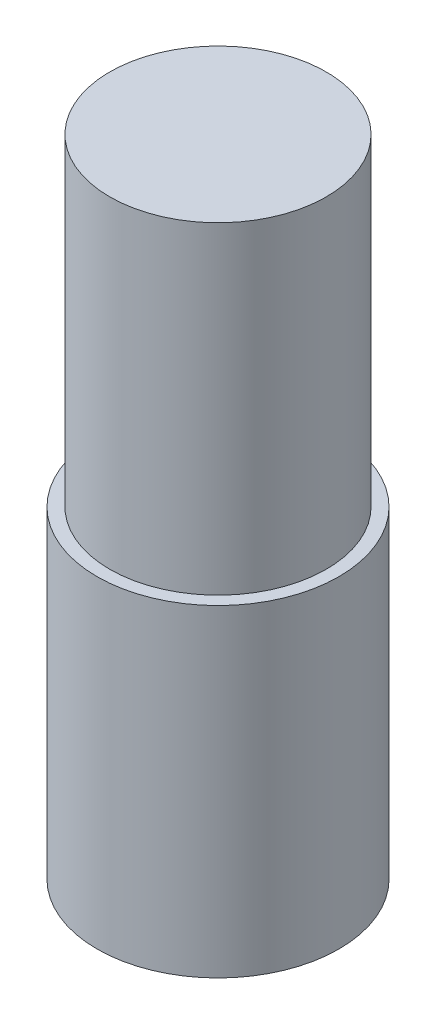
ISO-10303-21;
HEADER;
FILE_DESCRIPTION(('STEP AP214'),'2;1');
FILE_NAME('part.step','',(''),(''),'','','');
FILE_SCHEMA(('AUTOMOTIVE_DESIGN { 1 0 10303 214 1 1 1 1 }'));
ENDSEC;
DATA;
#1=APPLICATION_CONTEXT('core data for automotive mechanical design processes');
#2=APPLICATION_PROTOCOL_DEFINITION('international standard','automotive_design',2000,#1);
#3=PRODUCT_CONTEXT('',#1,'mechanical');
#4=PRODUCT('Part','Part','',(#3));
#5=PRODUCT_RELATED_PRODUCT_CATEGORY('part','',(#4));
#6=PRODUCT_DEFINITION_FORMATION('','',#4);
#7=PRODUCT_DEFINITION_CONTEXT('part definition',#1,'design');
#8=PRODUCT_DEFINITION('design','',#6,#7);
#9=PRODUCT_DEFINITION_SHAPE('','',#8);
#10=(LENGTH_UNIT() NAMED_UNIT(*) SI_UNIT(.MILLI.,.METRE.));
#11=(NAMED_UNIT(*) PLANE_ANGLE_UNIT() SI_UNIT($,.RADIAN.));
#12=(NAMED_UNIT(*) SI_UNIT($,.STERADIAN.) SOLID_ANGLE_UNIT());
#13=UNCERTAINTY_MEASURE_WITH_UNIT(LENGTH_MEASURE(1.E-05),#10,'distance_accuracy_value','');
#14=(GEOMETRIC_REPRESENTATION_CONTEXT(3) GLOBAL_UNCERTAINTY_ASSIGNED_CONTEXT((#13)) GLOBAL_UNIT_ASSIGNED_CONTEXT((#10,
#11,#12)) REPRESENTATION_CONTEXT('',''));
#15=CARTESIAN_POINT('',(0.,0.,0.));
#16=DIRECTION('',(0.,0.,1.));
#17=DIRECTION('',(1.,0.,0.));
#18=AXIS2_PLACEMENT_3D('',#15,#16,#17);
#19=CARTESIAN_POINT('',(0.,25.4,0.));
#20=DIRECTION('',(0.,-1.,0.));
#21=DIRECTION('',(0.,0.,-1.));
#22=AXIS2_PLACEMENT_3D('',#19,#20,#21);
#23=CYLINDRICAL_SURFACE('',#22,4.7625);
#24=CARTESIAN_POINT('',(0.,0.,0.));
#25=DIRECTION('',(0.,1.,0.));
#26=DIRECTION('',(0.,0.,1.));
#27=AXIS2_PLACEMENT_3D('',#24,#25,#26);
#28=CIRCLE('',#27,4.7625);
#29=CARTESIAN_POINT('',(0.,0.,4.7625));
#30=VERTEX_POINT('',#29);
#31=EDGE_CURVE('E10',#30,#30,#28,.T.);
#32=ORIENTED_EDGE('',*,*,#31,.T.);
#33=EDGE_LOOP('',(#32));
#34=FACE_BOUND('',#33,.T.);
#35=CARTESIAN_POINT('',(0.,12.7,0.));
#36=DIRECTION('',(0.,1.,0.));
#37=DIRECTION('',(0.,0.,1.));
#38=AXIS2_PLACEMENT_3D('',#35,#36,#37);
#39=CIRCLE('',#38,4.7625);
#40=CARTESIAN_POINT('',(0.,12.7,4.7625));
#41=VERTEX_POINT('',#40);
#42=EDGE_CURVE('E35',#41,#41,#39,.T.);
#43=ORIENTED_EDGE('',*,*,#42,.F.);
#44=EDGE_LOOP('',(#43));
#45=FACE_BOUND('',#44,.T.);
#46=ADVANCED_FACE('F32',(#34,#45),#23,.T.);
#47=CARTESIAN_POINT('',(0.,0.,0.));
#48=DIRECTION('',(0.,1.,0.));
#49=DIRECTION('',(0.,0.,1.));
#50=AXIS2_PLACEMENT_3D('',#47,#48,#49);
#51=PLANE('',#50);
#52=ORIENTED_EDGE('',*,*,#31,.F.);
#53=EDGE_LOOP('',(#52));
#54=FACE_BOUND('',#53,.T.);
#55=ADVANCED_FACE('F56',(#54),#51,.F.);
#56=CARTESIAN_POINT('',(0.,12.7,0.));
#57=DIRECTION('',(0.,1.,0.));
#58=DIRECTION('',(0.,0.,1.));
#59=AXIS2_PLACEMENT_3D('',#56,#57,#58);
#60=PLANE('',#59);
#61=CARTESIAN_POINT('',(0.,12.7,0.));
#62=DIRECTION('',(0.,1.,0.));
#63=DIRECTION('',(0.,0.,1.));
#64=AXIS2_PLACEMENT_3D('',#61,#62,#63);
#65=CIRCLE('',#64,4.2625);
#66=CARTESIAN_POINT('',(0.,12.7,4.2625));
#67=VERTEX_POINT('',#66);
#68=EDGE_CURVE('E42',#67,#67,#65,.T.);
#69=ORIENTED_EDGE('',*,*,#68,.F.);
#70=EDGE_LOOP('',(#69));
#71=FACE_BOUND('',#70,.T.);
#72=ORIENTED_EDGE('',*,*,#42,.T.);
#73=EDGE_LOOP('',(#72));
#74=FACE_BOUND('',#73,.T.);
#75=ADVANCED_FACE('F53',(#71,#74),#60,.T.);
#76=CARTESIAN_POINT('',(0.,12.7,0.));
#77=DIRECTION('',(0.,1.,0.));
#78=DIRECTION('',(0.,0.,1.));
#79=AXIS2_PLACEMENT_3D('',#76,#77,#78);
#80=CYLINDRICAL_SURFACE('',#79,4.2625);
#81=ORIENTED_EDGE('',*,*,#68,.T.);
#82=EDGE_LOOP('',(#81));
#83=FACE_BOUND('',#82,.T.);
#84=CARTESIAN_POINT('',(0.,25.4,0.));
#85=DIRECTION('',(0.,1.,0.));
#86=DIRECTION('',(0.,0.,1.));
#87=AXIS2_PLACEMENT_3D('',#84,#85,#86);
#88=CIRCLE('',#87,4.2625);
#89=CARTESIAN_POINT('',(0.,25.4,4.2625));
#90=VERTEX_POINT('',#89);
#91=EDGE_CURVE('E44',#90,#90,#88,.T.);
#92=ORIENTED_EDGE('',*,*,#91,.F.);
#93=EDGE_LOOP('',(#92));
#94=FACE_BOUND('',#93,.T.);
#95=ADVANCED_FACE('F50',(#83,#94),#80,.T.);
#96=CARTESIAN_POINT('',(0.,25.4,0.));
#97=DIRECTION('',(0.,1.,0.));
#98=DIRECTION('',(0.,0.,1.));
#99=AXIS2_PLACEMENT_3D('',#96,#97,#98);
#100=PLANE('',#99);
#101=ORIENTED_EDGE('',*,*,#91,.T.);
#102=EDGE_LOOP('',(#101));
#103=FACE_BOUND('',#102,.T.);
#104=ADVANCED_FACE('F68',(#103),#100,.T.);
#105=CLOSED_SHELL('',(#46,#55,#75,#95,#104));
#106=MANIFOLD_SOLID_BREP('B2',#105);
#107=ADVANCED_BREP_SHAPE_REPRESENTATION('',(#18,#106),#14);
#108=SHAPE_DEFINITION_REPRESENTATION(#9,#107);
ENDSEC;
END-ISO-10303-21;
